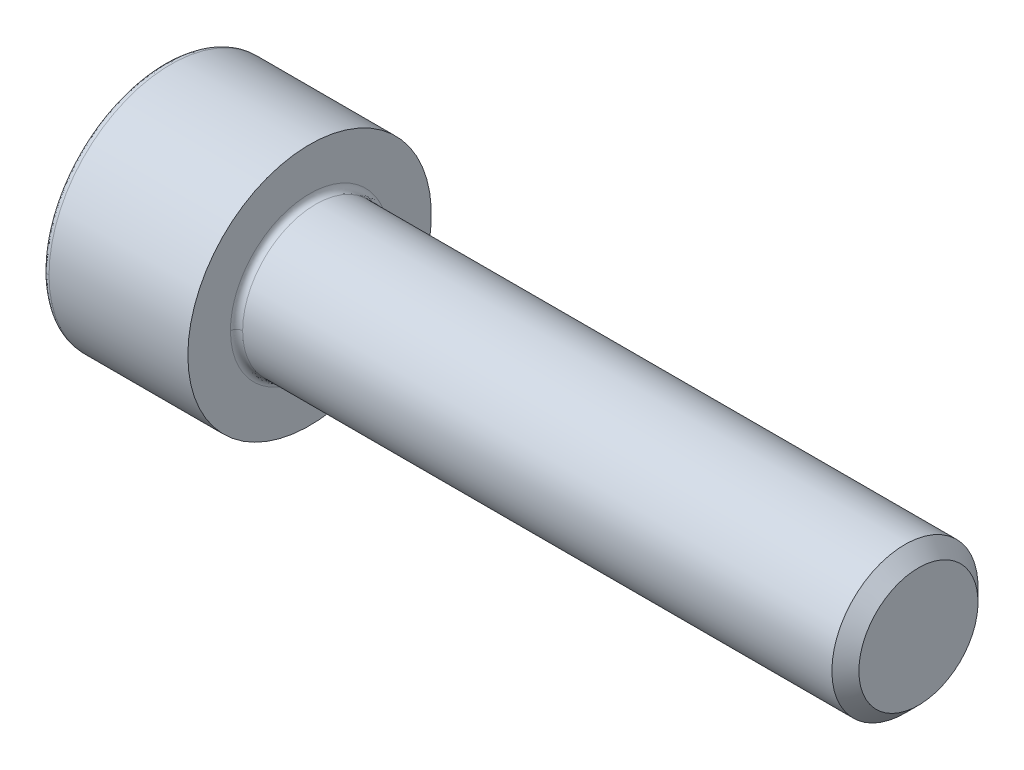
ISO-10303-21;
HEADER;
FILE_DESCRIPTION(('STEP AP214'),'2;1');
FILE_NAME('part.step','',(''),(''),'','','');
FILE_SCHEMA(('AUTOMOTIVE_DESIGN { 1 0 10303 214 1 1 1 1 }'));
ENDSEC;
DATA;
#1=APPLICATION_CONTEXT('core data for automotive mechanical design processes');
#2=APPLICATION_PROTOCOL_DEFINITION('international standard','automotive_design',2000,#1);
#3=PRODUCT_CONTEXT('',#1,'mechanical');
#4=PRODUCT('Part','Part','',(#3));
#5=PRODUCT_RELATED_PRODUCT_CATEGORY('part','',(#4));
#6=PRODUCT_DEFINITION_FORMATION('','',#4);
#7=PRODUCT_DEFINITION_CONTEXT('part definition',#1,'design');
#8=PRODUCT_DEFINITION('design','',#6,#7);
#9=PRODUCT_DEFINITION_SHAPE('','',#8);
#10=(LENGTH_UNIT() NAMED_UNIT(*) SI_UNIT(.MILLI.,.METRE.));
#11=(NAMED_UNIT(*) PLANE_ANGLE_UNIT() SI_UNIT($,.RADIAN.));
#12=(NAMED_UNIT(*) SI_UNIT($,.STERADIAN.) SOLID_ANGLE_UNIT());
#13=UNCERTAINTY_MEASURE_WITH_UNIT(LENGTH_MEASURE(1.E-05),#10,'distance_accuracy_value','');
#14=(GEOMETRIC_REPRESENTATION_CONTEXT(3) GLOBAL_UNCERTAINTY_ASSIGNED_CONTEXT((#13)) GLOBAL_UNIT_ASSIGNED_CONTEXT((#10,
#11,#12)) REPRESENTATION_CONTEXT('',''));
#15=CARTESIAN_POINT('',(0.,0.,0.));
#16=DIRECTION('',(0.,0.,1.));
#17=DIRECTION('',(1.,0.,0.));
#18=AXIS2_PLACEMENT_3D('',#15,#16,#17);
#19=CARTESIAN_POINT('',(31.,-2.474846,2.474846));
#20=DIRECTION('',(1.,0.,0.));
#21=DIRECTION('',(0.,0.,-1.));
#22=AXIS2_PLACEMENT_3D('',#19,#20,#21);
#23=PLANE('',#22);
#24=CARTESIAN_POINT('',(31.,0.,0.));
#25=DIRECTION('',(-1.,0.,0.));
#26=DIRECTION('',(0.,0.,1.));
#27=AXIS2_PLACEMENT_3D('',#24,#25,#26);
#28=CIRCLE('',#27,2.44549999999997);
#29=CARTESIAN_POINT('',(31.,0.,2.44549999999997));
#30=VERTEX_POINT('',#29);
#31=EDGE_CURVE('E19',#30,#30,#28,.F.);
#32=ORIENTED_EDGE('',*,*,#31,.T.);
#33=EDGE_LOOP('',(#32));
#34=FACE_BOUND('',#33,.T.);
#35=ADVANCED_FACE('F15',(#34),#23,.T.);
#36=CARTESIAN_POINT('',(31.,0.,0.));
#37=DIRECTION('',(-1.,0.,0.));
#38=DIRECTION('',(0.,0.,1.));
#39=AXIS2_PLACEMENT_3D('',#36,#37,#38);
#40=CONICAL_SURFACE('',#39,2.4455,0.785398163397446);
#41=CARTESIAN_POINT('',(30.4455,0.,0.));
#42=DIRECTION('',(-1.,0.,0.));
#43=DIRECTION('',(0.,0.,1.));
#44=AXIS2_PLACEMENT_3D('',#41,#42,#43);
#45=CIRCLE('',#44,3.);
#46=CARTESIAN_POINT('',(30.4455,0.,3.));
#47=VERTEX_POINT('',#46);
#48=EDGE_CURVE('E349',#47,#47,#45,.F.);
#49=ORIENTED_EDGE('',*,*,#48,.T.);
#50=EDGE_LOOP('',(#49));
#51=FACE_BOUND('',#50,.T.);
#52=ORIENTED_EDGE('',*,*,#31,.F.);
#53=EDGE_LOOP('',(#52));
#54=FACE_BOUND('',#53,.T.);
#55=ADVANCED_FACE('F438',(#51,#54),#40,.T.);
#56=CARTESIAN_POINT('',(30.4455,0.,0.));
#57=DIRECTION('',(-1.,0.,0.));
#58=DIRECTION('',(0.,-1.,0.));
#59=AXIS2_PLACEMENT_3D('',#56,#57,#58);
#60=CYLINDRICAL_SURFACE('',#59,3.);
#61=CARTESIAN_POINT('',(6.24999999978248,0.,0.));
#62=DIRECTION('',(1.,0.,0.));
#63=DIRECTION('',(0.,0.,-1.));
#64=AXIS2_PLACEMENT_3D('',#61,#62,#63);
#65=CIRCLE('',#64,3.00000000023549);
#66=CARTESIAN_POINT('',(6.24999999978248,-3.07655142772997E-10,-3.00000000017662));
#67=VERTEX_POINT('',#66);
#68=CARTESIAN_POINT('',(6.24999999983686,0.,3.00000000017662));
#69=VERTEX_POINT('',#68);
#70=EDGE_CURVE('E352',#67,#69,#65,.T.);
#71=ORIENTED_EDGE('',*,*,#70,.T.);
#72=CARTESIAN_POINT('',(6.24999999978248,0.,0.));
#73=DIRECTION('',(1.,0.,0.));
#74=DIRECTION('',(0.,0.,-1.));
#75=AXIS2_PLACEMENT_3D('',#72,#73,#74);
#76=CIRCLE('',#75,3.00000000023549);
#77=EDGE_CURVE('E341',#69,#67,#76,.T.);
#78=ORIENTED_EDGE('',*,*,#77,.T.);
#79=EDGE_LOOP('',(#71,#78));
#80=FACE_BOUND('',#79,.T.);
#81=ORIENTED_EDGE('',*,*,#48,.F.);
#82=EDGE_LOOP('',(#81));
#83=FACE_BOUND('',#82,.T.);
#84=ADVANCED_FACE('F326',(#80,#83),#60,.T.);
#85=CARTESIAN_POINT('',(6.001248959,0.,3.274958354));
#86=CARTESIAN_POINT('',(6.001248959,-6.549916708,3.274958354));
#87=CARTESIAN_POINT('',(6.001248959,-6.549916708,-3.274958354));
#88=CARTESIAN_POINT('',(6.001248959,0.,-3.274958354));
#89=CARTESIAN_POINT('',(5.984194894,0.,3.104986559));
#90=CARTESIAN_POINT('',(5.984194894,-6.209973117,3.104986559));
#91=CARTESIAN_POINT('',(5.984194894,-6.209973117,-3.104986559));
#92=CARTESIAN_POINT('',(5.984194894,0.,-3.104986559));
#93=CARTESIAN_POINT('',(6.104986559,0.,2.984194894));
#94=CARTESIAN_POINT('',(6.104986559,-5.968389789,2.984194894));
#95=CARTESIAN_POINT('',(6.104986559,-5.968389789,-2.984194894));
#96=CARTESIAN_POINT('',(6.104986559,0.,-2.984194894));
#97=CARTESIAN_POINT('',(6.274958354,0.,3.001248959));
#98=CARTESIAN_POINT('',(6.274958354,-6.002497917,3.001248959));
#99=CARTESIAN_POINT('',(6.274958354,-6.002497917,-3.001248959));
#100=CARTESIAN_POINT('',(6.274958354,0.,-3.001248959));
#101=(BOUNDED_SURFACE() B_SPLINE_SURFACE(3,3,((#85,#86,#87,#88),(#89,#90,#91,#92),(#93,#94,#95,
#96),(#97,#98,#99,#100)),.UNSPECIFIED.,.F.,.F.,.F.) B_SPLINE_SURFACE_WITH_KNOTS((4,4),(4,4),(0.,
1.),(0.,1.),.UNSPECIFIED.) GEOMETRIC_REPRESENTATION_ITEM() RATIONAL_B_SPLINE_SURFACE(((1.,
0.333333333333333,0.333333333333333,1.),(0.755320871117972,0.251773623705991,0.251773623705991,
0.755320871117972),(0.755320871117972,0.251773623705991,0.251773623705991,0.755320871117972),
(1.,0.333333333333333,0.333333333333333,1.))) REPRESENTATION_ITEM('') SURFACE());
#102=CARTESIAN_POINT('',(6.001248959,0.,3.274958354));
#103=CARTESIAN_POINT('',(5.984194894,0.,3.104986559));
#104=CARTESIAN_POINT('',(6.104986559,0.,2.984194894));
#105=CARTESIAN_POINT('',(6.274958354,0.,3.001248959));
#106=(BOUNDED_CURVE() B_SPLINE_CURVE(3,(#102,#103,#104,#105),.UNSPECIFIED.,.F.,
.F.) B_SPLINE_CURVE_WITH_KNOTS((4,4),(0.,1.),
.UNSPECIFIED.) CURVE() GEOMETRIC_REPRESENTATION_ITEM() RATIONAL_B_SPLINE_CURVE((1.,
0.755320871117972,0.755320871117972,1.)) REPRESENTATION_ITEM(''));
#107=CARTESIAN_POINT('',(6.00000000014129,0.,3.24999999964183));
#108=VERTEX_POINT('',#107);
#109=EDGE_CURVE('E301',#69,#108,#106,.F.);
#110=CARTESIAN_POINT('',(6.00000000023549,0.,3.24999999981333));
#111=CARTESIAN_POINT('',(6.00000000023549,-6.49999999950396,3.24999999981333));
#112=CARTESIAN_POINT('',(6.00000000023549,-6.49999999950396,-3.24999999981333));
#113=CARTESIAN_POINT('',(6.00000000023549,0.,-3.24999999981333));
#114=(BOUNDED_CURVE() B_SPLINE_CURVE(3,(#110,#111,#112,#113),.UNSPECIFIED.,.F.,
.F.) B_SPLINE_CURVE_WITH_KNOTS((4,4),(0.,1.),
.UNSPECIFIED.) CURVE() GEOMETRIC_REPRESENTATION_ITEM() RATIONAL_B_SPLINE_CURVE((0.95657830221489,
0.31885943407163,0.31885943407163,0.95657830221489)) REPRESENTATION_ITEM(''));
#115=CARTESIAN_POINT('',(6.00000000014129,0.,-3.24999999964183));
#116=VERTEX_POINT('',#115);
#117=EDGE_CURVE('E361',#116,#108,#114,.F.);
#118=CARTESIAN_POINT('',(6.001248959,0.,-3.274958354));
#119=CARTESIAN_POINT('',(5.984194894,0.,-3.104986559));
#120=CARTESIAN_POINT('',(6.104986559,0.,-2.984194894));
#121=CARTESIAN_POINT('',(6.274958354,0.,-3.001248959));
#122=(BOUNDED_CURVE() B_SPLINE_CURVE(3,(#118,#119,#120,#121),.UNSPECIFIED.,.F.,
.F.) B_SPLINE_CURVE_WITH_KNOTS((4,4),(0.,1.),
.UNSPECIFIED.) CURVE() GEOMETRIC_REPRESENTATION_ITEM() RATIONAL_B_SPLINE_CURVE((1.,
0.755320871117972,0.755320871117972,1.)) REPRESENTATION_ITEM(''));
#123=EDGE_CURVE('E348',#116,#67,#122,.T.);
#124=ORIENTED_EDGE('',*,*,#109,.T.);
#125=ORIENTED_EDGE('',*,*,#117,.F.);
#126=ORIENTED_EDGE('',*,*,#123,.T.);
#127=ORIENTED_EDGE('',*,*,#77,.F.);
#128=EDGE_LOOP('',(#124,#125,#126,#127));
#129=FACE_BOUND('',#128,.T.);
#130=ADVANCED_FACE('F315',(#129),#101,.F.);
#131=CARTESIAN_POINT('',(6.001248959,0.,-3.274958354));
#132=CARTESIAN_POINT('',(6.001248959,6.549916708,-3.274958354));
#133=CARTESIAN_POINT('',(6.001248959,6.549916708,3.274958354));
#134=CARTESIAN_POINT('',(6.001248959,0.,3.274958354));
#135=CARTESIAN_POINT('',(5.984194894,0.,-3.104986559));
#136=CARTESIAN_POINT('',(5.984194894,6.209973117,-3.104986559));
#137=CARTESIAN_POINT('',(5.984194894,6.209973117,3.104986559));
#138=CARTESIAN_POINT('',(5.984194894,0.,3.104986559));
#139=CARTESIAN_POINT('',(6.104986559,0.,-2.984194894));
#140=CARTESIAN_POINT('',(6.104986559,5.968389789,-2.984194894));
#141=CARTESIAN_POINT('',(6.104986559,5.968389789,2.984194894));
#142=CARTESIAN_POINT('',(6.104986559,0.,2.984194894));
#143=CARTESIAN_POINT('',(6.274958354,0.,-3.001248959));
#144=CARTESIAN_POINT('',(6.274958354,6.002497917,-3.001248959));
#145=CARTESIAN_POINT('',(6.274958354,6.002497917,3.001248959));
#146=CARTESIAN_POINT('',(6.274958354,0.,3.001248959));
#147=(BOUNDED_SURFACE() B_SPLINE_SURFACE(3,3,((#131,#132,#133,#134),(#135,#136,#137,#138),(#139,
#140,#141,#142),(#143,#144,#145,#146)),.UNSPECIFIED.,.F.,.F.,
.F.) B_SPLINE_SURFACE_WITH_KNOTS((4,4),(4,4),(0.,1.),(0.,1.),
.UNSPECIFIED.) GEOMETRIC_REPRESENTATION_ITEM() RATIONAL_B_SPLINE_SURFACE(((1.,0.333333333333333,
0.333333333333333,1.),(0.755320871117972,0.251773623705991,0.251773623705991,0.755320871117972),
(0.755320871117972,0.251773623705991,0.251773623705991,0.755320871117972),(1.,0.333333333333333,
0.333333333333333,1.))) REPRESENTATION_ITEM('') SURFACE());
#148=CARTESIAN_POINT('',(6.00000000023549,0.,-3.24999999981333));
#149=CARTESIAN_POINT('',(6.00000000023549,6.49999999950396,-3.24999999981333));
#150=CARTESIAN_POINT('',(6.00000000023549,6.49999999950396,3.24999999981333));
#151=CARTESIAN_POINT('',(6.00000000023549,0.,3.24999999981333));
#152=(BOUNDED_CURVE() B_SPLINE_CURVE(3,(#148,#149,#150,#151),.UNSPECIFIED.,.F.,
.F.) B_SPLINE_CURVE_WITH_KNOTS((4,4),(0.,1.),
.UNSPECIFIED.) CURVE() GEOMETRIC_REPRESENTATION_ITEM() RATIONAL_B_SPLINE_CURVE((0.956578302214891,
0.31885943407163,0.31885943407163,0.956578302214891)) REPRESENTATION_ITEM(''));
#153=EDGE_CURVE('E297',#108,#116,#152,.F.);
#154=ORIENTED_EDGE('',*,*,#70,.F.);
#155=ORIENTED_EDGE('',*,*,#123,.F.);
#156=ORIENTED_EDGE('',*,*,#153,.F.);
#157=ORIENTED_EDGE('',*,*,#109,.F.);
#158=EDGE_LOOP('',(#154,#155,#156,#157));
#159=FACE_BOUND('',#158,.T.);
#160=ADVANCED_FACE('F303',(#159),#147,.F.);
#161=CARTESIAN_POINT('',(6.,-5.06,5.06));
#162=DIRECTION('',(1.,0.,0.));
#163=DIRECTION('',(0.,0.,-1.));
#164=AXIS2_PLACEMENT_3D('',#161,#162,#163);
#165=PLANE('',#164);
#166=ORIENTED_EDGE('',*,*,#117,.T.);
#167=ORIENTED_EDGE('',*,*,#153,.T.);
#168=EDGE_LOOP('',(#166,#167));
#169=FACE_BOUND('',#168,.T.);
#170=CARTESIAN_POINT('',(6.,0.,0.));
#171=DIRECTION('',(-1.,0.,0.));
#172=DIRECTION('',(0.,0.,1.));
#173=AXIS2_PLACEMENT_3D('',#170,#171,#172);
#174=CIRCLE('',#173,5.);
#175=CARTESIAN_POINT('',(6.,0.,5.));
#176=VERTEX_POINT('',#175);
#177=EDGE_CURVE('E285',#176,#176,#174,.F.);
#178=ORIENTED_EDGE('',*,*,#177,.T.);
#179=EDGE_LOOP('',(#178));
#180=FACE_BOUND('',#179,.T.);
#181=ADVANCED_FACE('F314',(#169,#180),#165,.T.);
#182=CARTESIAN_POINT('',(6.,0.,0.));
#183=DIRECTION('',(-1.,0.,0.));
#184=DIRECTION('',(0.,0.,1.));
#185=AXIS2_PLACEMENT_3D('',#182,#183,#184);
#186=CYLINDRICAL_SURFACE('',#185,5.);
#187=ORIENTED_EDGE('',*,*,#177,.F.);
#188=EDGE_LOOP('',(#187));
#189=FACE_BOUND('',#188,.T.);
#190=CARTESIAN_POINT('',(0.29999999980743,0.,0.));
#191=DIRECTION('',(-1.,0.,0.));
#192=DIRECTION('',(0.,-1.,0.));
#193=AXIS2_PLACEMENT_3D('',#190,#191,#192);
#194=CIRCLE('',#193,5.00000000038587);
#195=CARTESIAN_POINT('',(0.299999999855573,-2.24484071071833E-10,5.0000000002894));
#196=VERTEX_POINT('',#195);
#197=CARTESIAN_POINT('',(0.29999999980743,-5.12758571288328E-10,-5.0000000002894));
#198=VERTEX_POINT('',#197);
#199=EDGE_CURVE('E282',#196,#198,#194,.T.);
#200=ORIENTED_EDGE('',*,*,#199,.F.);
#201=CARTESIAN_POINT('',(0.29999999980743,0.,0.));
#202=DIRECTION('',(-1.,0.,0.));
#203=DIRECTION('',(0.,-1.,0.));
#204=AXIS2_PLACEMENT_3D('',#201,#202,#203);
#205=CIRCLE('',#204,5.00000000038587);
#206=EDGE_CURVE('E288',#198,#196,#205,.T.);
#207=ORIENTED_EDGE('',*,*,#206,.F.);
#208=EDGE_LOOP('',(#200,#207));
#209=FACE_BOUND('',#208,.T.);
#210=ADVANCED_FACE('F229',(#189,#209),#186,.T.);
#211=CARTESIAN_POINT('',(0.00149875,0.,4.670049975));
#212=CARTESIAN_POINT('',(0.00149875,9.34009995,4.670049975));
#213=CARTESIAN_POINT('',(0.00149875,9.34009995,-4.670049975));
#214=CARTESIAN_POINT('',(0.00149875,0.,-4.670049975));
#215=CARTESIAN_POINT('',(-0.018966127,0.,4.87401613));
#216=CARTESIAN_POINT('',(-0.018966127,9.748032259,4.87401613));
#217=CARTESIAN_POINT('',(-0.018966127,9.748032259,-4.87401613));
#218=CARTESIAN_POINT('',(-0.018966127,0.,-4.87401613));
#219=CARTESIAN_POINT('',(0.12598387,0.,5.018966127));
#220=CARTESIAN_POINT('',(0.12598387,10.037932254,5.018966127));
#221=CARTESIAN_POINT('',(0.12598387,10.037932254,-5.018966127));
#222=CARTESIAN_POINT('',(0.12598387,0.,-5.018966127));
#223=CARTESIAN_POINT('',(0.329950025,0.,4.99850125));
#224=CARTESIAN_POINT('',(0.329950025,9.997002499,4.99850125));
#225=CARTESIAN_POINT('',(0.329950025,9.997002499,-4.99850125));
#226=CARTESIAN_POINT('',(0.329950025,0.,-4.99850125));
#227=(BOUNDED_SURFACE() B_SPLINE_SURFACE(3,3,((#211,#212,#213,#214),(#215,#216,#217,#218),(#219,
#220,#221,#222),(#223,#224,#225,#226)),.UNSPECIFIED.,.F.,.F.,
.F.) B_SPLINE_SURFACE_WITH_KNOTS((4,4),(4,4),(0.,1.),(0.,1.),
.UNSPECIFIED.) GEOMETRIC_REPRESENTATION_ITEM() RATIONAL_B_SPLINE_SURFACE(((1.,0.333333333333333,
0.333333333333333,1.),(0.755320871117972,0.251773623705991,0.251773623705991,0.755320871117972),
(0.755320871117972,0.251773623705991,0.251773623705991,0.755320871117972),(1.,0.333333333333333,
0.333333333333333,1.))) REPRESENTATION_ITEM('') SURFACE());
#228=CARTESIAN_POINT('',(-3.85867261707578E-10,0.,-4.70000000022572));
#229=CARTESIAN_POINT('',(-3.85867264776779E-10,9.4000000003199,-4.70000000022572));
#230=CARTESIAN_POINT('',(-3.85867264776779E-10,9.4000000003199,4.70000000022572));
#231=CARTESIAN_POINT('',(-3.85867261707578E-10,0.,4.70000000022572));
#232=(BOUNDED_CURVE() B_SPLINE_CURVE(3,(#228,#229,#230,#231),.UNSPECIFIED.,.F.,
.F.) B_SPLINE_CURVE_WITH_KNOTS((4,4),(0.,1.),
.UNSPECIFIED.) CURVE() GEOMETRIC_REPRESENTATION_ITEM() RATIONAL_B_SPLINE_CURVE((0.95657830212221,
0.318859434040737,0.318859434040737,0.95657830212221)) REPRESENTATION_ITEM(''));
#233=CARTESIAN_POINT('',(-2.3152035707117E-10,0.,4.69999999919632));
#234=VERTEX_POINT('',#233);
#235=CARTESIAN_POINT('',(-2.3152035707117E-10,0.,-4.69999999919632));
#236=VERTEX_POINT('',#235);
#237=EDGE_CURVE('E84',#234,#236,#232,.F.);
#238=CARTESIAN_POINT('',(0.00149875,0.,4.670049975));
#239=CARTESIAN_POINT('',(-0.018966127,0.,4.87401613));
#240=CARTESIAN_POINT('',(0.12598387,0.,5.018966127));
#241=CARTESIAN_POINT('',(0.329950025,0.,4.99850125));
#242=(BOUNDED_CURVE() B_SPLINE_CURVE(3,(#238,#239,#240,#241),.UNSPECIFIED.,.F.,
.F.) B_SPLINE_CURVE_WITH_KNOTS((4,4),(0.,1.),
.UNSPECIFIED.) CURVE() GEOMETRIC_REPRESENTATION_ITEM() RATIONAL_B_SPLINE_CURVE((1.,
0.755320871117972,0.755320871117972,1.)) REPRESENTATION_ITEM(''));
#243=EDGE_CURVE('E202',#196,#234,#242,.F.);
#244=CARTESIAN_POINT('',(0.00149875,0.,-4.670049975));
#245=CARTESIAN_POINT('',(-0.018966127,0.,-4.87401613));
#246=CARTESIAN_POINT('',(0.12598387,0.,-5.018966127));
#247=CARTESIAN_POINT('',(0.329950025,0.,-4.99850125));
#248=(BOUNDED_CURVE() B_SPLINE_CURVE(3,(#244,#245,#246,#247),.UNSPECIFIED.,.F.,
.F.) B_SPLINE_CURVE_WITH_KNOTS((4,4),(0.,1.),
.UNSPECIFIED.) CURVE() GEOMETRIC_REPRESENTATION_ITEM() RATIONAL_B_SPLINE_CURVE((1.,
0.755320871117972,0.755320871117972,1.)) REPRESENTATION_ITEM(''));
#249=EDGE_CURVE('E284',#236,#198,#248,.T.);
#250=ORIENTED_EDGE('',*,*,#237,.F.);
#251=ORIENTED_EDGE('',*,*,#243,.F.);
#252=ORIENTED_EDGE('',*,*,#199,.T.);
#253=ORIENTED_EDGE('',*,*,#249,.F.);
#254=EDGE_LOOP('',(#250,#251,#252,#253));
#255=FACE_BOUND('',#254,.T.);
#256=ADVANCED_FACE('F217',(#255),#227,.T.);
#257=CARTESIAN_POINT('',(0.00149875,0.,-4.670049975));
#258=CARTESIAN_POINT('',(0.00149875,-9.34009995,-4.670049975));
#259=CARTESIAN_POINT('',(0.00149875,-9.34009995,4.670049975));
#260=CARTESIAN_POINT('',(0.00149875,0.,4.670049975));
#261=CARTESIAN_POINT('',(-0.018966127,0.,-4.87401613));
#262=CARTESIAN_POINT('',(-0.018966127,-9.748032259,-4.87401613));
#263=CARTESIAN_POINT('',(-0.018966127,-9.748032259,4.87401613));
#264=CARTESIAN_POINT('',(-0.018966127,0.,4.87401613));
#265=CARTESIAN_POINT('',(0.12598387,0.,-5.018966127));
#266=CARTESIAN_POINT('',(0.12598387,-10.037932254,-5.018966127));
#267=CARTESIAN_POINT('',(0.12598387,-10.037932254,5.018966127));
#268=CARTESIAN_POINT('',(0.12598387,0.,5.018966127));
#269=CARTESIAN_POINT('',(0.329950025,0.,-4.99850125));
#270=CARTESIAN_POINT('',(0.329950025,-9.997002499,-4.99850125));
#271=CARTESIAN_POINT('',(0.329950025,-9.997002499,4.99850125));
#272=CARTESIAN_POINT('',(0.329950025,0.,4.99850125));
#273=(BOUNDED_SURFACE() B_SPLINE_SURFACE(3,3,((#257,#258,#259,#260),(#261,#262,#263,#264),(#265,
#266,#267,#268),(#269,#270,#271,#272)),.UNSPECIFIED.,.F.,.F.,
.F.) B_SPLINE_SURFACE_WITH_KNOTS((4,4),(4,4),(0.,1.),(0.,1.),
.UNSPECIFIED.) GEOMETRIC_REPRESENTATION_ITEM() RATIONAL_B_SPLINE_SURFACE(((1.,0.333333333333333,
0.333333333333333,1.),(0.755320871117972,0.251773623705991,0.251773623705991,0.755320871117972),
(0.755320871117972,0.251773623705991,0.251773623705991,0.755320871117972),(1.,0.333333333333333,
0.333333333333333,1.))) REPRESENTATION_ITEM('') SURFACE());
#274=CARTESIAN_POINT('',(-3.85867261925231E-10,0.,4.70000000022572));
#275=CARTESIAN_POINT('',(-3.85867264679281E-10,-9.4000000003199,4.70000000022572));
#276=CARTESIAN_POINT('',(-3.85867264679281E-10,-9.4000000003199,-4.70000000022572));
#277=CARTESIAN_POINT('',(-3.85867261925231E-10,0.,-4.70000000022572));
#278=(BOUNDED_CURVE() B_SPLINE_CURVE(3,(#274,#275,#276,#277),.UNSPECIFIED.,.F.,
.F.) B_SPLINE_CURVE_WITH_KNOTS((4,4),(0.,1.),
.UNSPECIFIED.) CURVE() GEOMETRIC_REPRESENTATION_ITEM() RATIONAL_B_SPLINE_CURVE((0.95657830212221,
0.318859434040737,0.318859434040737,0.95657830212221)) REPRESENTATION_ITEM(''));
#279=EDGE_CURVE('E197',#236,#234,#278,.F.);
#280=ORIENTED_EDGE('',*,*,#243,.T.);
#281=ORIENTED_EDGE('',*,*,#279,.F.);
#282=ORIENTED_EDGE('',*,*,#249,.T.);
#283=ORIENTED_EDGE('',*,*,#206,.T.);
#284=EDGE_LOOP('',(#280,#281,#282,#283));
#285=FACE_BOUND('',#284,.T.);
#286=ADVANCED_FACE('F204',(#285),#273,.T.);
#287=CARTESIAN_POINT('',(0.,1.467624384,2.542));
#288=DIRECTION('',(0.,-0.866025403678227,-0.500000000183963));
#289=DIRECTION('',(0.,0.500000000183963,-0.866025403678227));
#290=AXIS2_PLACEMENT_3D('',#287,#288,#289);
#291=PLANE('',#290);
#292=DIRECTION('',(0.,-0.500000000183963,0.866025403678227));
#293=VECTOR('',#292,1.);
#294=CARTESIAN_POINT('',(3.,2.2014365765,1.271));
#295=LINE('',#294,#293);
#296=CARTESIAN_POINT('',(3.,2.20143657635501,1.27100000025113));
#297=VERTEX_POINT('',#296);
#298=CARTESIAN_POINT('',(3.,1.467624384,2.542));
#299=VERTEX_POINT('',#298);
#300=EDGE_CURVE('E263',#297,#299,#295,.T.);
#301=ORIENTED_EDGE('',*,*,#300,.T.);
#302=DIRECTION('',(-1.,0.,0.));
#303=VECTOR('',#302,1.);
#304=CARTESIAN_POINT('',(1.5,1.467624384,2.542));
#305=LINE('',#304,#303);
#306=CARTESIAN_POINT('',(0.,1.4676243852548,2.541999999613));
#307=VERTEX_POINT('',#306);
#308=EDGE_CURVE('E182',#299,#307,#305,.T.);
#309=ORIENTED_EDGE('',*,*,#308,.T.);
#310=DIRECTION('',(0.,-0.50000000064581,0.86602540341158));
#311=VECTOR('',#310,1.);
#312=CARTESIAN_POINT('',(0.,2.9352487730192,0.));
#313=LINE('',#312,#311);
#314=CARTESIAN_POINT('',(0.,2.9352487717632,-4.35091117865008E-10));
#315=VERTEX_POINT('',#314);
#316=EDGE_CURVE('E192',#315,#307,#313,.T.);
#317=ORIENTED_EDGE('',*,*,#316,.F.);
#318=DIRECTION('',(1.,0.,0.));
#319=VECTOR('',#318,1.);
#320=CARTESIAN_POINT('',(1.5,2.935248769,0.));
#321=LINE('',#320,#319);
#322=CARTESIAN_POINT('',(3.,2.935248769,0.));
#323=VERTEX_POINT('',#322);
#324=EDGE_CURVE('E75',#315,#323,#321,.T.);
#325=ORIENTED_EDGE('',*,*,#324,.T.);
#326=DIRECTION('',(0.,-0.500000000183963,0.866025403678227));
#327=VECTOR('',#326,1.);
#328=CARTESIAN_POINT('',(3.,2.2014365765,1.271));
#329=LINE('',#328,#327);
#330=EDGE_CURVE('E261',#323,#297,#329,.T.);
#331=ORIENTED_EDGE('',*,*,#330,.T.);
#332=EDGE_LOOP('',(#301,#309,#317,#325,#331));
#333=FACE_BOUND('',#332,.T.);
#334=ADVANCED_FACE('F216',(#333),#291,.T.);
#335=CARTESIAN_POINT('',(0.,1.467624384,2.542));
#336=DIRECTION('',(0.,0.,1.));
#337=DIRECTION('',(0.,-1.,0.));
#338=AXIS2_PLACEMENT_3D('',#335,#336,#337);
#339=PLANE('',#338);
#340=ORIENTED_EDGE('',*,*,#308,.F.);
#341=DIRECTION('',(0.,1.,0.));
#342=VECTOR('',#341,1.);
#343=CARTESIAN_POINT('',(3.,0.,2.542));
#344=LINE('',#343,#342);
#345=CARTESIAN_POINT('',(3.,-2.28255403465839E-10,2.542));
#346=VERTEX_POINT('',#345);
#347=EDGE_CURVE('E186',#346,#299,#344,.T.);
#348=ORIENTED_EDGE('',*,*,#347,.F.);
#349=DIRECTION('',(0.,1.,0.));
#350=VECTOR('',#349,1.);
#351=CARTESIAN_POINT('',(3.,0.,2.542));
#352=LINE('',#351,#350);
#353=CARTESIAN_POINT('',(3.,-1.467624384,2.542));
#354=VERTEX_POINT('',#353);
#355=EDGE_CURVE('E122',#354,#346,#352,.T.);
#356=ORIENTED_EDGE('',*,*,#355,.F.);
#357=DIRECTION('',(1.,0.,0.));
#358=VECTOR('',#357,1.);
#359=CARTESIAN_POINT('',(1.5,-1.467624384,2.542));
#360=LINE('',#359,#358);
#361=CARTESIAN_POINT('',(0.,-1.4676243852548,2.541999999613));
#362=VERTEX_POINT('',#361);
#363=EDGE_CURVE('E185',#362,#354,#360,.T.);
#364=ORIENTED_EDGE('',*,*,#363,.F.);
#365=DIRECTION('',(0.,-1.,0.));
#366=VECTOR('',#365,1.);
#367=CARTESIAN_POINT('',(0.,0.,2.541999999484));
#368=LINE('',#367,#366);
#369=EDGE_CURVE('E189',#307,#362,#368,.T.);
#370=ORIENTED_EDGE('',*,*,#369,.F.);
#371=EDGE_LOOP('',(#340,#348,#356,#364,#370));
#372=FACE_BOUND('',#371,.T.);
#373=ADVANCED_FACE('F466',(#372),#339,.F.);
#374=CARTESIAN_POINT('',(0.,-2.935248769,0.));
#375=DIRECTION('',(0.,0.866025403678227,-0.500000000183963));
#376=DIRECTION('',(0.,0.500000000183963,0.866025403678227));
#377=AXIS2_PLACEMENT_3D('',#374,#375,#376);
#378=PLANE('',#377);
#379=DIRECTION('',(0.,-0.500000000183963,-0.866025403678227));
#380=VECTOR('',#379,1.);
#381=CARTESIAN_POINT('',(3.,-2.2014365765,1.271));
#382=LINE('',#381,#380);
#383=CARTESIAN_POINT('',(3.,-2.20143657635501,1.27100000025113));
#384=VERTEX_POINT('',#383);
#385=CARTESIAN_POINT('',(3.,-2.935248769,0.));
#386=VERTEX_POINT('',#385);
#387=EDGE_CURVE('E179',#384,#386,#382,.T.);
#388=ORIENTED_EDGE('',*,*,#387,.T.);
#389=DIRECTION('',(1.,0.,0.));
#390=VECTOR('',#389,1.);
#391=CARTESIAN_POINT('',(1.5,-2.935248769,0.));
#392=LINE('',#391,#390);
#393=CARTESIAN_POINT('',(0.,-2.9352487717632,4.35090866656742E-10));
#394=VERTEX_POINT('',#393);
#395=EDGE_CURVE('E172',#394,#386,#392,.T.);
#396=ORIENTED_EDGE('',*,*,#395,.F.);
#397=DIRECTION('',(0.,-0.50000000064581,-0.86602540341158));
#398=VECTOR('',#397,1.);
#399=CARTESIAN_POINT('',(0.,-1.4676243865096,2.541999999484));
#400=LINE('',#399,#398);
#401=EDGE_CURVE('E191',#362,#394,#400,.T.);
#402=ORIENTED_EDGE('',*,*,#401,.F.);
#403=ORIENTED_EDGE('',*,*,#363,.T.);
#404=DIRECTION('',(0.,-0.500000000183963,-0.866025403678227));
#405=VECTOR('',#404,1.);
#406=CARTESIAN_POINT('',(3.,-2.2014365765,1.271));
#407=LINE('',#406,#405);
#408=EDGE_CURVE('E114',#354,#384,#407,.T.);
#409=ORIENTED_EDGE('',*,*,#408,.T.);
#410=EDGE_LOOP('',(#388,#396,#402,#403,#409));
#411=FACE_BOUND('',#410,.T.);
#412=ADVANCED_FACE('F462',(#411),#378,.T.);
#413=CARTESIAN_POINT('',(0.,1.467624384,-2.542));
#414=DIRECTION('',(0.,0.866025403678227,-0.500000000183963));
#415=DIRECTION('',(0.,0.500000000183963,0.866025403678227));
#416=AXIS2_PLACEMENT_3D('',#413,#414,#415);
#417=PLANE('',#416);
#418=DIRECTION('',(1.,0.,0.));
#419=VECTOR('',#418,1.);
#420=CARTESIAN_POINT('',(1.5,1.467624384,-2.542));
#421=LINE('',#420,#419);
#422=CARTESIAN_POINT('',(0.,1.46762438510584,-2.542));
#423=VERTEX_POINT('',#422);
#424=CARTESIAN_POINT('',(3.,1.46762438411084,-2.542));
#425=VERTEX_POINT('',#424);
#426=EDGE_CURVE('E153',#423,#425,#421,.T.);
#427=ORIENTED_EDGE('',*,*,#426,.T.);
#428=DIRECTION('',(0.,-0.500000000183963,-0.866025403678227));
#429=VECTOR('',#428,1.);
#430=CARTESIAN_POINT('',(3.,2.2014365765,-1.271));
#431=LINE('',#430,#429);
#432=CARTESIAN_POINT('',(3.,2.20143657656491,-1.27099999981833));
#433=VERTEX_POINT('',#432);
#434=EDGE_CURVE('E170',#433,#425,#431,.T.);
#435=ORIENTED_EDGE('',*,*,#434,.F.);
#436=DIRECTION('',(0.,-0.500000000183963,-0.866025403678227));
#437=VECTOR('',#436,1.);
#438=CARTESIAN_POINT('',(3.,2.2014365765,-1.271));
#439=LINE('',#438,#437);
#440=EDGE_CURVE('E173',#323,#433,#439,.T.);
#441=ORIENTED_EDGE('',*,*,#440,.F.);
#442=ORIENTED_EDGE('',*,*,#324,.F.);
#443=DIRECTION('',(0.,0.50000000064581,0.86602540341158));
#444=VECTOR('',#443,1.);
#445=CARTESIAN_POINT('',(0.,1.4676243865096,-2.541999999484));
#446=LINE('',#445,#444);
#447=EDGE_CURVE('E156',#423,#315,#446,.T.);
#448=ORIENTED_EDGE('',*,*,#447,.F.);
#449=EDGE_LOOP('',(#427,#435,#441,#442,#448));
#450=FACE_BOUND('',#449,.T.);
#451=ADVANCED_FACE('F476',(#450),#417,.F.);
#452=CARTESIAN_POINT('',(0.,-1.467624384,-2.542));
#453=DIRECTION('',(0.,0.866025403678227,0.500000000183963));
#454=DIRECTION('',(0.,-0.500000000183963,0.866025403678227));
#455=AXIS2_PLACEMENT_3D('',#452,#453,#454);
#456=PLANE('',#455);
#457=DIRECTION('',(0.,0.500000000183963,-0.866025403678227));
#458=VECTOR('',#457,1.);
#459=CARTESIAN_POINT('',(3.,-2.2014365765,-1.271));
#460=LINE('',#459,#458);
#461=CARTESIAN_POINT('',(3.,-2.20143657645078,-1.27100000001601));
#462=VERTEX_POINT('',#461);
#463=CARTESIAN_POINT('',(3.,-1.46762438401385,-2.541999999976));
#464=VERTEX_POINT('',#463);
#465=EDGE_CURVE('E134',#462,#464,#460,.T.);
#466=ORIENTED_EDGE('',*,*,#465,.T.);
#467=DIRECTION('',(-1.,0.,0.));
#468=VECTOR('',#467,1.);
#469=CARTESIAN_POINT('',(1.5,-1.467624384,-2.542));
#470=LINE('',#469,#468);
#471=CARTESIAN_POINT('',(0.,-1.46762438510584,-2.542));
#472=VERTEX_POINT('',#471);
#473=EDGE_CURVE('E137',#464,#472,#470,.T.);
#474=ORIENTED_EDGE('',*,*,#473,.T.);
#475=DIRECTION('',(0.,0.50000000064581,-0.86602540341158));
#476=VECTOR('',#475,1.);
#477=CARTESIAN_POINT('',(0.,-2.9352487730192,0.));
#478=LINE('',#477,#476);
#479=EDGE_CURVE('E427',#394,#472,#478,.T.);
#480=ORIENTED_EDGE('',*,*,#479,.F.);
#481=ORIENTED_EDGE('',*,*,#395,.T.);
#482=DIRECTION('',(0.,0.500000000183963,-0.866025403678227));
#483=VECTOR('',#482,1.);
#484=CARTESIAN_POINT('',(3.,-2.2014365765,-1.271));
#485=LINE('',#484,#483);
#486=EDGE_CURVE('E140',#386,#462,#485,.T.);
#487=ORIENTED_EDGE('',*,*,#486,.T.);
#488=EDGE_LOOP('',(#466,#474,#480,#481,#487));
#489=FACE_BOUND('',#488,.T.);
#490=ADVANCED_FACE('F135',(#489),#456,.T.);
#491=CARTESIAN_POINT('',(0.,-4.7564,-4.7564));
#492=DIRECTION('',(-1.,0.,0.));
#493=DIRECTION('',(0.,0.,1.));
#494=AXIS2_PLACEMENT_3D('',#491,#492,#493);
#495=PLANE('',#494);
#496=DIRECTION('',(0.,1.,0.));
#497=VECTOR('',#496,1.);
#498=CARTESIAN_POINT('',(0.,0.,-2.542));
#499=LINE('',#498,#497);
#500=EDGE_CURVE('E148',#472,#423,#499,.T.);
#501=ORIENTED_EDGE('',*,*,#500,.T.);
#502=ORIENTED_EDGE('',*,*,#447,.T.);
#503=ORIENTED_EDGE('',*,*,#316,.T.);
#504=ORIENTED_EDGE('',*,*,#369,.T.);
#505=ORIENTED_EDGE('',*,*,#401,.T.);
#506=ORIENTED_EDGE('',*,*,#479,.T.);
#507=EDGE_LOOP('',(#501,#502,#503,#504,#505,#506));
#508=FACE_BOUND('',#507,.T.);
#509=ORIENTED_EDGE('',*,*,#237,.T.);
#510=ORIENTED_EDGE('',*,*,#279,.T.);
#511=EDGE_LOOP('',(#509,#510));
#512=FACE_BOUND('',#511,.T.);
#513=ADVANCED_FACE('F392',(#508,#512),#495,.T.);
#514=CARTESIAN_POINT('',(0.,-1.467624384,-2.542));
#515=DIRECTION('',(0.,0.,-1.));
#516=DIRECTION('',(0.,1.,0.));
#517=AXIS2_PLACEMENT_3D('',#514,#515,#516);
#518=PLANE('',#517);
#519=ORIENTED_EDGE('',*,*,#473,.F.);
#520=DIRECTION('',(0.,-1.,0.));
#521=VECTOR('',#520,1.);
#522=CARTESIAN_POINT('',(3.,0.,-2.542));
#523=LINE('',#522,#521);
#524=CARTESIAN_POINT('',(3.,-5.21372915285972E-10,-2.542));
#525=VERTEX_POINT('',#524);
#526=EDGE_CURVE('E34',#525,#464,#523,.T.);
#527=ORIENTED_EDGE('',*,*,#526,.F.);
#528=DIRECTION('',(0.,-1.,0.));
#529=VECTOR('',#528,1.);
#530=CARTESIAN_POINT('',(3.,1.1007182885,-2.542));
#531=LINE('',#530,#529);
#532=EDGE_CURVE('E177',#425,#525,#531,.T.);
#533=ORIENTED_EDGE('',*,*,#532,.F.);
#534=ORIENTED_EDGE('',*,*,#426,.F.);
#535=ORIENTED_EDGE('',*,*,#500,.F.);
#536=EDGE_LOOP('',(#519,#527,#533,#534,#535));
#537=FACE_BOUND('',#536,.T.);
#538=ADVANCED_FACE('F146',(#537),#518,.F.);
#539=CARTESIAN_POINT('',(3.,-0.013208619,1.263374));
#540=DIRECTION('',(-1.,0.,0.));
#541=DIRECTION('',(0.,0.,1.));
#542=AXIS2_PLACEMENT_3D('',#539,#540,#541);
#543=PLANE('',#542);
#544=ORIENTED_EDGE('',*,*,#347,.T.);
#545=ORIENTED_EDGE('',*,*,#300,.F.);
#546=CARTESIAN_POINT('',(3.,0.,0.));
#547=DIRECTION('',(-1.,0.,0.));
#548=DIRECTION('',(0.,0.,1.));
#549=AXIS2_PLACEMENT_3D('',#546,#547,#548);
#550=CIRCLE('',#549,2.542);
#551=EDGE_CURVE('E423',#346,#297,#550,.T.);
#552=ORIENTED_EDGE('',*,*,#551,.F.);
#553=EDGE_LOOP('',(#544,#545,#552));
#554=FACE_BOUND('',#553,.T.);
#555=ADVANCED_FACE('F471',(#554),#543,.T.);
#556=CARTESIAN_POINT('',(3.,2.197033703,-1.286252));
#557=DIRECTION('',(-1.,0.,0.));
#558=DIRECTION('',(0.,0.,1.));
#559=AXIS2_PLACEMENT_3D('',#556,#557,#558);
#560=PLANE('',#559);
#561=ORIENTED_EDGE('',*,*,#330,.F.);
#562=ORIENTED_EDGE('',*,*,#440,.T.);
#563=CARTESIAN_POINT('',(3.,0.,0.));
#564=DIRECTION('',(-1.,0.,0.));
#565=DIRECTION('',(0.,0.,1.));
#566=AXIS2_PLACEMENT_3D('',#563,#564,#565);
#567=CIRCLE('',#566,2.542);
#568=EDGE_CURVE('E420',#297,#433,#567,.T.);
#569=ORIENTED_EDGE('',*,*,#568,.F.);
#570=EDGE_LOOP('',(#561,#562,#569));
#571=FACE_BOUND('',#570,.T.);
#572=ADVANCED_FACE('F475',(#571),#560,.T.);
#573=CARTESIAN_POINT('',(3.,-0.013208619,-2.542));
#574=DIRECTION('',(-1.,0.,0.));
#575=DIRECTION('',(0.,0.,1.));
#576=AXIS2_PLACEMENT_3D('',#573,#574,#575);
#577=PLANE('',#576);
#578=ORIENTED_EDGE('',*,*,#434,.T.);
#579=ORIENTED_EDGE('',*,*,#532,.T.);
#580=CARTESIAN_POINT('',(3.,0.,0.));
#581=DIRECTION('',(-1.,0.,0.));
#582=DIRECTION('',(0.,0.,1.));
#583=AXIS2_PLACEMENT_3D('',#580,#581,#582);
#584=CIRCLE('',#583,2.542);
#585=EDGE_CURVE('E417',#433,#525,#584,.T.);
#586=ORIENTED_EDGE('',*,*,#585,.F.);
#587=EDGE_LOOP('',(#578,#579,#586));
#588=FACE_BOUND('',#587,.T.);
#589=ADVANCED_FACE('F478',(#588),#577,.T.);
#590=CARTESIAN_POINT('',(3.,-2.214645196,-2.542));
#591=DIRECTION('',(-1.,0.,0.));
#592=DIRECTION('',(0.,0.,1.));
#593=AXIS2_PLACEMENT_3D('',#590,#591,#592);
#594=PLANE('',#593);
#595=ORIENTED_EDGE('',*,*,#526,.T.);
#596=ORIENTED_EDGE('',*,*,#465,.F.);
#597=CARTESIAN_POINT('',(3.,0.,0.));
#598=DIRECTION('',(-1.,0.,0.));
#599=DIRECTION('',(0.,0.,1.));
#600=AXIS2_PLACEMENT_3D('',#597,#598,#599);
#601=CIRCLE('',#600,2.542);
#602=EDGE_CURVE('E152',#525,#462,#601,.T.);
#603=ORIENTED_EDGE('',*,*,#602,.F.);
#604=EDGE_LOOP('',(#595,#596,#603));
#605=FACE_BOUND('',#604,.T.);
#606=ADVANCED_FACE('F150',(#605),#594,.T.);
#607=CARTESIAN_POINT('',(3.,-2.939651642,-1.286252));
#608=DIRECTION('',(-1.,0.,0.));
#609=DIRECTION('',(0.,0.,1.));
#610=AXIS2_PLACEMENT_3D('',#607,#608,#609);
#611=PLANE('',#610);
#612=ORIENTED_EDGE('',*,*,#486,.F.);
#613=ORIENTED_EDGE('',*,*,#387,.F.);
#614=CARTESIAN_POINT('',(3.,0.,0.));
#615=DIRECTION('',(-1.,0.,0.));
#616=DIRECTION('',(0.,0.,1.));
#617=AXIS2_PLACEMENT_3D('',#614,#615,#616);
#618=CIRCLE('',#617,2.542);
#619=EDGE_CURVE('E25',#462,#384,#618,.T.);
#620=ORIENTED_EDGE('',*,*,#619,.F.);
#621=EDGE_LOOP('',(#612,#613,#620));
#622=FACE_BOUND('',#621,.T.);
#623=ADVANCED_FACE('F455',(#622),#611,.T.);
#624=CARTESIAN_POINT('',(3.,-2.214645196,1.263374));
#625=DIRECTION('',(-1.,0.,0.));
#626=DIRECTION('',(0.,0.,1.));
#627=AXIS2_PLACEMENT_3D('',#624,#625,#626);
#628=PLANE('',#627);
#629=ORIENTED_EDGE('',*,*,#408,.F.);
#630=ORIENTED_EDGE('',*,*,#355,.T.);
#631=CARTESIAN_POINT('',(3.,0.,0.));
#632=DIRECTION('',(-1.,0.,0.));
#633=DIRECTION('',(0.,0.,1.));
#634=AXIS2_PLACEMENT_3D('',#631,#632,#633);
#635=CIRCLE('',#634,2.542);
#636=EDGE_CURVE('E10',#384,#346,#635,.T.);
#637=ORIENTED_EDGE('',*,*,#636,.F.);
#638=EDGE_LOOP('',(#629,#630,#637));
#639=FACE_BOUND('',#638,.T.);
#640=ADVANCED_FACE('F17',(#639),#628,.T.);
#641=CARTESIAN_POINT('',(4.467624384,0.,0.));
#642=DIRECTION('',(-1.,0.,0.));
#643=DIRECTION('',(0.,0.,1.));
#644=AXIS2_PLACEMENT_3D('',#641,#642,#643);
#645=CONICAL_SURFACE('',#644,0.,1.04719755127922);
#646=CARTESIAN_POINT('',(4.467624384,0.,0.));
#647=VERTEX_POINT('',#646);
#648=VERTEX_LOOP('',#647);
#649=FACE_BOUND('',#648,.T.);
#650=ORIENTED_EDGE('',*,*,#619,.T.);
#651=ORIENTED_EDGE('',*,*,#636,.T.);
#652=ORIENTED_EDGE('',*,*,#551,.T.);
#653=ORIENTED_EDGE('',*,*,#568,.T.);
#654=ORIENTED_EDGE('',*,*,#585,.T.);
#655=ORIENTED_EDGE('',*,*,#602,.T.);
#656=EDGE_LOOP('',(#650,#651,#652,#653,#654,#655));
#657=FACE_BOUND('',#656,.T.);
#658=ADVANCED_FACE('F218',(#649,#657),#645,.F.);
#659=CLOSED_SHELL('',(#35,#55,#84,#130,#160,#181,#210,#256,#286,#334,#373,#412,#451,#490,#513,
#538,#555,#572,#589,#606,#623,#640,#658));
#660=MANIFOLD_SOLID_BREP('B1',#659);
#661=ADVANCED_BREP_SHAPE_REPRESENTATION('',(#18,#660),#14);
#662=SHAPE_DEFINITION_REPRESENTATION(#9,#661);
ENDSEC;
END-ISO-10303-21;
